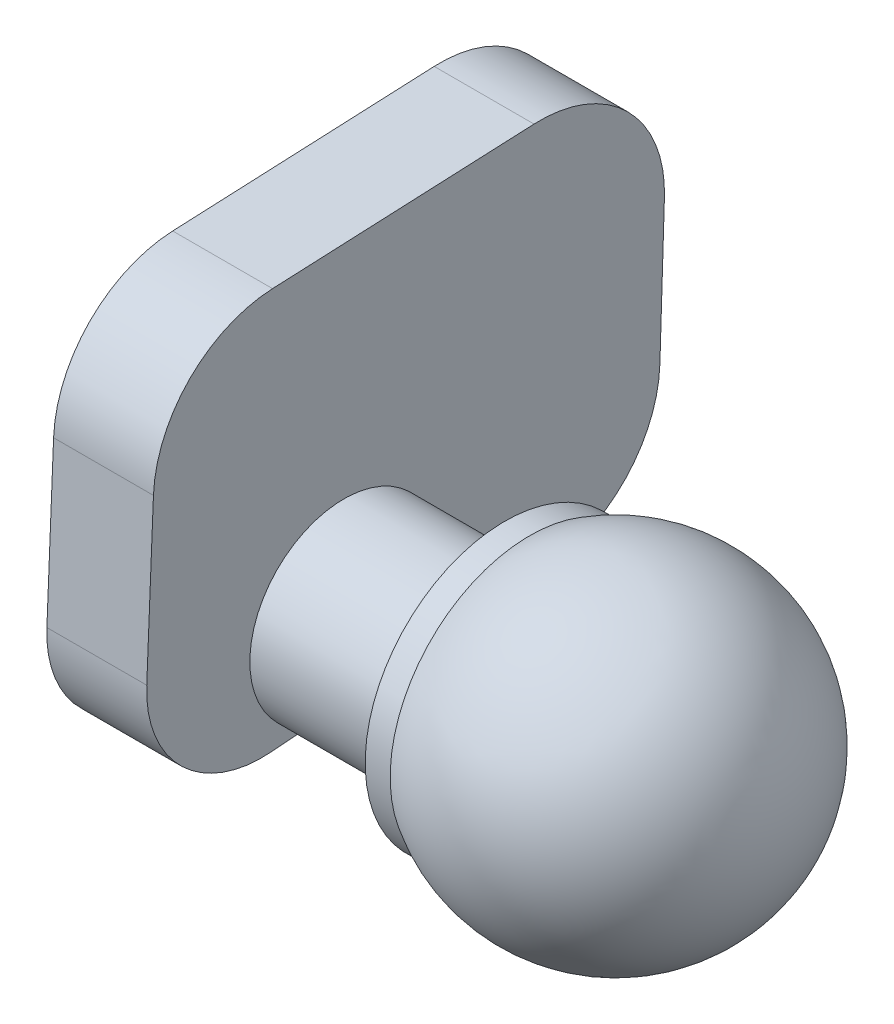
ISO-10303-21;
HEADER;
FILE_DESCRIPTION(('STEP AP214'),'2;1');
FILE_NAME('part.step','',(''),(''),'','','');
FILE_SCHEMA(('AUTOMOTIVE_DESIGN { 1 0 10303 214 1 1 1 1 }'));
ENDSEC;
DATA;
#1=APPLICATION_CONTEXT('core data for automotive mechanical design processes');
#2=APPLICATION_PROTOCOL_DEFINITION('international standard','automotive_design',2000,#1);
#3=PRODUCT_CONTEXT('',#1,'mechanical');
#4=PRODUCT('Part','Part','',(#3));
#5=PRODUCT_RELATED_PRODUCT_CATEGORY('part','',(#4));
#6=PRODUCT_DEFINITION_FORMATION('','',#4);
#7=PRODUCT_DEFINITION_CONTEXT('part definition',#1,'design');
#8=PRODUCT_DEFINITION('design','',#6,#7);
#9=PRODUCT_DEFINITION_SHAPE('','',#8);
#10=(LENGTH_UNIT() NAMED_UNIT(*) SI_UNIT(.MILLI.,.METRE.));
#11=(NAMED_UNIT(*) PLANE_ANGLE_UNIT() SI_UNIT($,.RADIAN.));
#12=(NAMED_UNIT(*) SI_UNIT($,.STERADIAN.) SOLID_ANGLE_UNIT());
#13=UNCERTAINTY_MEASURE_WITH_UNIT(LENGTH_MEASURE(1.E-05),#10,'distance_accuracy_value','');
#14=(GEOMETRIC_REPRESENTATION_CONTEXT(3) GLOBAL_UNCERTAINTY_ASSIGNED_CONTEXT((#13)) GLOBAL_UNIT_ASSIGNED_CONTEXT((#10,
#11,#12)) REPRESENTATION_CONTEXT('',''));
#15=CARTESIAN_POINT('',(0.,0.,0.));
#16=DIRECTION('',(0.,0.,1.));
#17=DIRECTION('',(1.,0.,0.));
#18=AXIS2_PLACEMENT_3D('',#15,#16,#17);
#19=CARTESIAN_POINT('',(4.,15.4804604314108,-19.2046076505677));
#20=DIRECTION('',(-1.,0.,0.));
#21=DIRECTION('',(0.,0.,1.));
#22=AXIS2_PLACEMENT_3D('',#19,#20,#21);
#23=CYLINDRICAL_SURFACE('',#22,4.62863554698001);
#24=CARTESIAN_POINT('',(0.,15.4804604314108,-19.2046076505677));
#25=DIRECTION('',(1.,0.,0.));
#26=DIRECTION('',(0.,0.,1.));
#27=AXIS2_PLACEMENT_3D('',#24,#25,#26);
#28=CIRCLE('',#27,4.62863554698001);
#29=CARTESIAN_POINT('',(0.,15.6727888455283,-14.5799696314477));
#30=VERTEX_POINT('',#29);
#31=CARTESIAN_POINT('',(0.,10.8655075399622,-19.5602434705827));
#32=VERTEX_POINT('',#31);
#33=EDGE_CURVE('E139',#30,#32,#28,.T.);
#34=ORIENTED_EDGE('',*,*,#33,.T.);
#35=DIRECTION('',(-1.,0.,0.));
#36=VECTOR('',#35,1.);
#37=CARTESIAN_POINT('',(4.,10.8655075399622,-19.5602434705827));
#38=LINE('',#37,#36);
#39=CARTESIAN_POINT('',(4.,10.8655075399622,-19.5602434705827));
#40=VERTEX_POINT('',#39);
#41=EDGE_CURVE('E41',#40,#32,#38,.T.);
#42=ORIENTED_EDGE('',*,*,#41,.F.);
#43=CARTESIAN_POINT('',(4.,15.4804604314108,-19.2046076505677));
#44=DIRECTION('',(1.,0.,0.));
#45=DIRECTION('',(0.,0.,1.));
#46=AXIS2_PLACEMENT_3D('',#43,#44,#45);
#47=CIRCLE('',#46,4.62863554698001);
#48=CARTESIAN_POINT('',(4.,15.6727888455283,-14.5799696314477));
#49=VERTEX_POINT('',#48);
#50=EDGE_CURVE('E155',#49,#40,#47,.T.);
#51=ORIENTED_EDGE('',*,*,#50,.F.);
#52=DIRECTION('',(-1.,0.,0.));
#53=VECTOR('',#52,1.);
#54=CARTESIAN_POINT('',(4.,15.6727888455283,-14.5799696314477));
#55=LINE('',#54,#53);
#56=EDGE_CURVE('E135',#49,#30,#55,.T.);
#57=ORIENTED_EDGE('',*,*,#56,.T.);
#58=EDGE_LOOP('',(#34,#42,#51,#57));
#59=FACE_BOUND('',#58,.T.);
#60=ADVANCED_FACE('F32',(#59),#23,.T.);
#61=CARTESIAN_POINT('',(4.,10.8655075399622,-19.5602434705827));
#62=DIRECTION('',(0.,0.997043911668439,0.0768338350266204));
#63=DIRECTION('',(0.,-0.0768338350266204,0.997043911668439));
#64=AXIS2_PLACEMENT_3D('',#61,#62,#63);
#65=PLANE('',#64);
#66=DIRECTION('',(0.,0.0768338350266204,-0.997043911668439));
#67=VECTOR('',#66,1.);
#68=CARTESIAN_POINT('',(0.,10.8655075399622,-19.5602434705827));
#69=LINE('',#68,#67);
#70=CARTESIAN_POINT('',(0.,11.7101605718647,-30.5209896397527));
#71=VERTEX_POINT('',#70);
#72=EDGE_CURVE('E142',#32,#71,#69,.T.);
#73=ORIENTED_EDGE('',*,*,#72,.T.);
#74=DIRECTION('',(-1.,0.,0.));
#75=VECTOR('',#74,1.);
#76=CARTESIAN_POINT('',(4.,11.7101605718647,-30.5209896397527));
#77=LINE('',#76,#75);
#78=CARTESIAN_POINT('',(4.,11.7101605718647,-30.5209896397527));
#79=VERTEX_POINT('',#78);
#80=EDGE_CURVE('E165',#79,#71,#77,.T.);
#81=ORIENTED_EDGE('',*,*,#80,.F.);
#82=DIRECTION('',(0.,0.0768338350266204,-0.997043911668439));
#83=VECTOR('',#82,1.);
#84=CARTESIAN_POINT('',(4.,10.8655075399622,-19.5602434705827));
#85=LINE('',#84,#83);
#86=CARTESIAN_POINT('',(4.,11.2475056293288,-24.5172896617561));
#87=VERTEX_POINT('',#86);
#88=EDGE_CURVE('E193',#87,#79,#85,.T.);
#89=ORIENTED_EDGE('',*,*,#88,.F.);
#90=CARTESIAN_POINT('',(4.,10.9725772527079,-20.9496470475379));
#91=VERTEX_POINT('',#90);
#92=EDGE_CURVE('E192',#91,#87,#85,.T.);
#93=ORIENTED_EDGE('',*,*,#92,.F.);
#94=EDGE_CURVE('E97',#40,#91,#85,.T.);
#95=ORIENTED_EDGE('',*,*,#94,.F.);
#96=ORIENTED_EDGE('',*,*,#41,.T.);
#97=EDGE_LOOP('',(#73,#81,#89,#93,#95,#96));
#98=FACE_BOUND('',#97,.T.);
#99=ADVANCED_FACE('F168',(#98),#65,.F.);
#100=CARTESIAN_POINT('',(4.,16.6953801302069,-30.1368204646196));
#101=DIRECTION('',(-1.,0.,0.));
#102=DIRECTION('',(0.,0.,1.));
#103=AXIS2_PLACEMENT_3D('',#100,#101,#102);
#104=CYLINDRICAL_SURFACE('',#103,5.00000000000001);
#105=CARTESIAN_POINT('',(0.,16.6953801302069,-30.1368204646196));
#106=DIRECTION('',(1.,0.,0.));
#107=DIRECTION('',(0.,0.,1.));
#108=AXIS2_PLACEMENT_3D('',#105,#106,#107);
#109=CIRCLE('',#108,5.00000000000001);
#110=CARTESIAN_POINT('',(0.,16.5360030051006,-35.1342797122767));
#111=VERTEX_POINT('',#110);
#112=EDGE_CURVE('E145',#71,#111,#109,.T.);
#113=ORIENTED_EDGE('',*,*,#112,.T.);
#114=DIRECTION('',(-1.,0.,0.));
#115=VECTOR('',#114,1.);
#116=CARTESIAN_POINT('',(4.,16.5360030051006,-35.1342797122767));
#117=LINE('',#116,#115);
#118=CARTESIAN_POINT('',(4.,16.5360030051006,-35.1342797122767));
#119=VERTEX_POINT('',#118);
#120=EDGE_CURVE('E162',#119,#111,#117,.T.);
#121=ORIENTED_EDGE('',*,*,#120,.F.);
#122=CARTESIAN_POINT('',(4.,16.6953801302069,-30.1368204646196));
#123=DIRECTION('',(1.,0.,0.));
#124=DIRECTION('',(0.,0.,1.));
#125=AXIS2_PLACEMENT_3D('',#122,#123,#124);
#126=CIRCLE('',#125,5.00000000000001);
#127=EDGE_CURVE('E187',#79,#119,#126,.T.);
#128=ORIENTED_EDGE('',*,*,#127,.F.);
#129=ORIENTED_EDGE('',*,*,#80,.T.);
#130=EDGE_LOOP('',(#113,#121,#128,#129));
#131=FACE_BOUND('',#130,.T.);
#132=ADVANCED_FACE('F180',(#131),#104,.T.);
#133=CARTESIAN_POINT('',(4.,22.2281323093602,-35.3158109983341));
#134=DIRECTION('',(0.,0.031875425021274,0.999491849531407));
#135=DIRECTION('',(0.,-0.999491849531407,0.031875425021274));
#136=AXIS2_PLACEMENT_3D('',#133,#134,#135);
#137=PLANE('',#136);
#138=DIRECTION('',(0.,0.999491849531407,-0.031875425021274));
#139=VECTOR('',#138,1.);
#140=CARTESIAN_POINT('',(0.,22.2281323093602,-35.3158109983341));
#141=LINE('',#140,#139);
#142=CARTESIAN_POINT('',(0.,22.2281323093602,-35.3158109983341));
#143=VERTEX_POINT('',#142);
#144=EDGE_CURVE('E147',#111,#143,#141,.T.);
#145=ORIENTED_EDGE('',*,*,#144,.T.);
#146=DIRECTION('',(-1.,0.,0.));
#147=VECTOR('',#146,1.);
#148=CARTESIAN_POINT('',(4.,22.2281323093602,-35.3158109983341));
#149=LINE('',#148,#147);
#150=CARTESIAN_POINT('',(4.,22.2281323093602,-35.3158109983341));
#151=VERTEX_POINT('',#150);
#152=EDGE_CURVE('E159',#151,#143,#149,.T.);
#153=ORIENTED_EDGE('',*,*,#152,.F.);
#154=DIRECTION('',(0.,0.999491849531407,-0.031875425021274));
#155=VECTOR('',#154,1.);
#156=CARTESIAN_POINT('',(4.,22.2281323093602,-35.3158109983341));
#157=LINE('',#156,#155);
#158=EDGE_CURVE('E186',#119,#151,#157,.T.);
#159=ORIENTED_EDGE('',*,*,#158,.F.);
#160=ORIENTED_EDGE('',*,*,#120,.T.);
#161=EDGE_LOOP('',(#145,#153,#159,#160));
#162=FACE_BOUND('',#161,.T.);
#163=ADVANCED_FACE('F184',(#162),#137,.F.);
#164=CARTESIAN_POINT('',(4.,22.3875094344666,-30.318351750677));
#165=DIRECTION('',(-1.,0.,0.));
#166=DIRECTION('',(0.,0.,1.));
#167=AXIS2_PLACEMENT_3D('',#164,#165,#166);
#168=CYLINDRICAL_SURFACE('',#167,5.);
#169=CARTESIAN_POINT('',(0.,22.3875094344666,-30.318351750677));
#170=DIRECTION('',(1.,0.,0.));
#171=DIRECTION('',(0.,0.,1.));
#172=AXIS2_PLACEMENT_3D('',#169,#170,#171);
#173=CIRCLE('',#172,5.);
#174=CARTESIAN_POINT('',(0.,27.3824435532535,-30.0933336425655));
#175=VERTEX_POINT('',#174);
#176=EDGE_CURVE('E149',#143,#175,#173,.T.);
#177=ORIENTED_EDGE('',*,*,#176,.T.);
#178=DIRECTION('',(-1.,0.,0.));
#179=VECTOR('',#178,1.);
#180=CARTESIAN_POINT('',(4.,27.3824435532535,-30.0933336425655));
#181=LINE('',#180,#179);
#182=CARTESIAN_POINT('',(4.,27.3824435532535,-30.0933336425655));
#183=VERTEX_POINT('',#182);
#184=EDGE_CURVE('E130',#183,#175,#181,.T.);
#185=ORIENTED_EDGE('',*,*,#184,.F.);
#186=CARTESIAN_POINT('',(4.,22.3875094344666,-30.318351750677));
#187=DIRECTION('',(1.,0.,0.));
#188=DIRECTION('',(0.,0.,1.));
#189=AXIS2_PLACEMENT_3D('',#186,#187,#188);
#190=CIRCLE('',#189,5.);
#191=EDGE_CURVE('E118',#151,#183,#190,.T.);
#192=ORIENTED_EDGE('',*,*,#191,.F.);
#193=ORIENTED_EDGE('',*,*,#152,.T.);
#194=EDGE_LOOP('',(#177,#185,#192,#193));
#195=FACE_BOUND('',#194,.T.);
#196=ADVANCED_FACE('F230',(#195),#168,.T.);
#197=CARTESIAN_POINT('',(4.,26.9105780208937,-19.6188999765666));
#198=DIRECTION('',(0.,-0.998986823757389,-0.0450036216223152));
#199=DIRECTION('',(0.,0.0450036216223152,-0.998986823757389));
#200=AXIS2_PLACEMENT_3D('',#197,#198,#199);
#201=PLANE('',#200);
#202=DIRECTION('',(0.,-0.0450036216223151,0.998986823757388));
#203=VECTOR('',#202,1.);
#204=CARTESIAN_POINT('',(0.,26.9105780208937,-19.6188999765666));
#205=LINE('',#204,#203);
#206=CARTESIAN_POINT('',(0.,26.9105780208937,-19.6188999765666));
#207=VERTEX_POINT('',#206);
#208=EDGE_CURVE('E127',#175,#207,#205,.T.);
#209=ORIENTED_EDGE('',*,*,#208,.T.);
#210=DIRECTION('',(-1.,0.,0.));
#211=VECTOR('',#210,1.);
#212=CARTESIAN_POINT('',(4.,26.9105780208937,-19.6188999765666));
#213=LINE('',#212,#211);
#214=CARTESIAN_POINT('',(4.,26.9105780208937,-19.6188999765666));
#215=VERTEX_POINT('',#214);
#216=EDGE_CURVE('E124',#215,#207,#213,.T.);
#217=ORIENTED_EDGE('',*,*,#216,.F.);
#218=DIRECTION('',(0.,-0.0450036216223151,0.998986823757388));
#219=VECTOR('',#218,1.);
#220=CARTESIAN_POINT('',(4.,26.9105780208937,-19.6188999765666));
#221=LINE('',#220,#219);
#222=EDGE_CURVE('E111',#183,#215,#221,.T.);
#223=ORIENTED_EDGE('',*,*,#222,.F.);
#224=ORIENTED_EDGE('',*,*,#184,.T.);
#225=EDGE_LOOP('',(#209,#217,#223,#224));
#226=FACE_BOUND('',#225,.T.);
#227=ADVANCED_FACE('F125',(#226),#201,.F.);
#228=CARTESIAN_POINT('',(4.,21.9156439021068,-19.8439180846781));
#229=DIRECTION('',(-1.,0.,0.));
#230=DIRECTION('',(0.,0.,1.));
#231=AXIS2_PLACEMENT_3D('',#228,#229,#230);
#232=CYLINDRICAL_SURFACE('',#231,5.);
#233=CARTESIAN_POINT('',(0.,21.9156439021068,-19.8439180846781));
#234=DIRECTION('',(1.,0.,0.));
#235=DIRECTION('',(0.,0.,-1.));
#236=AXIS2_PLACEMENT_3D('',#233,#234,#235);
#237=CIRCLE('',#236,5.);
#238=CARTESIAN_POINT('',(0.,22.1234031998149,-14.8482363419912));
#239=VERTEX_POINT('',#238);
#240=EDGE_CURVE('E152',#207,#239,#237,.T.);
#241=ORIENTED_EDGE('',*,*,#240,.T.);
#242=DIRECTION('',(-1.,0.,0.));
#243=VECTOR('',#242,1.);
#244=CARTESIAN_POINT('',(4.,22.1234031998149,-14.8482363419912));
#245=LINE('',#244,#243);
#246=CARTESIAN_POINT('',(4.,22.1234031998149,-14.8482363419912));
#247=VERTEX_POINT('',#246);
#248=EDGE_CURVE('E131',#247,#239,#245,.T.);
#249=ORIENTED_EDGE('',*,*,#248,.F.);
#250=CARTESIAN_POINT('',(4.,21.9156439021068,-19.8439180846781));
#251=DIRECTION('',(1.,0.,0.));
#252=DIRECTION('',(0.,0.,-1.));
#253=AXIS2_PLACEMENT_3D('',#250,#251,#252);
#254=CIRCLE('',#253,5.);
#255=EDGE_CURVE('E115',#215,#247,#254,.T.);
#256=ORIENTED_EDGE('',*,*,#255,.F.);
#257=ORIENTED_EDGE('',*,*,#216,.T.);
#258=EDGE_LOOP('',(#241,#249,#256,#257));
#259=FACE_BOUND('',#258,.T.);
#260=ADVANCED_FACE('F133',(#259),#232,.T.);
#261=CARTESIAN_POINT('',(4.,22.1234031998149,-14.8482363419912));
#262=DIRECTION('',(0.,-0.0415518595416226,-0.999136348537392));
#263=DIRECTION('',(0.,0.999136348537392,-0.0415518595416226));
#264=AXIS2_PLACEMENT_3D('',#261,#262,#263);
#265=PLANE('',#264);
#266=DIRECTION('',(0.,-0.999136348537392,0.0415518595416226));
#267=VECTOR('',#266,1.);
#268=CARTESIAN_POINT('',(0.,22.1234031998149,-14.8482363419912));
#269=LINE('',#268,#267);
#270=EDGE_CURVE('E89',#239,#30,#269,.T.);
#271=ORIENTED_EDGE('',*,*,#270,.T.);
#272=ORIENTED_EDGE('',*,*,#56,.F.);
#273=DIRECTION('',(0.,-0.999136348537392,0.0415518595416226));
#274=VECTOR('',#273,1.);
#275=CARTESIAN_POINT('',(4.,22.1234031998149,-14.8482363419912));
#276=LINE('',#275,#274);
#277=EDGE_CURVE('E56',#247,#49,#276,.T.);
#278=ORIENTED_EDGE('',*,*,#277,.F.);
#279=ORIENTED_EDGE('',*,*,#248,.T.);
#280=EDGE_LOOP('',(#271,#272,#278,#279));
#281=FACE_BOUND('',#280,.T.);
#282=ADVANCED_FACE('F238',(#281),#265,.F.);
#283=CARTESIAN_POINT('',(4.,15.4804604314108,-19.2046076505677));
#284=DIRECTION('',(-1.,0.,0.));
#285=DIRECTION('',(0.,0.,1.));
#286=AXIS2_PLACEMENT_3D('',#283,#284,#285);
#287=PLANE('',#286);
#288=CARTESIAN_POINT('',(4.,14.4186612649548,-22.4785006980142));
#289=DIRECTION('',(1.,0.,0.));
#290=DIRECTION('',(0.,0.,-1.));
#291=AXIS2_PLACEMENT_3D('',#288,#289,#290);
#292=CIRCLE('',#291,3.76999847533634);
#293=EDGE_CURVE('E11',#87,#91,#292,.T.);
#294=ORIENTED_EDGE('',*,*,#293,.F.);
#295=ORIENTED_EDGE('',*,*,#88,.T.);
#296=ORIENTED_EDGE('',*,*,#127,.T.);
#297=ORIENTED_EDGE('',*,*,#158,.T.);
#298=ORIENTED_EDGE('',*,*,#191,.T.);
#299=ORIENTED_EDGE('',*,*,#222,.T.);
#300=ORIENTED_EDGE('',*,*,#255,.T.);
#301=ORIENTED_EDGE('',*,*,#277,.T.);
#302=ORIENTED_EDGE('',*,*,#50,.T.);
#303=ORIENTED_EDGE('',*,*,#94,.T.);
#304=EDGE_LOOP('',(#294,#295,#296,#297,#298,#299,#300,#301,#302,#303));
#305=FACE_BOUND('',#304,.T.);
#306=ADVANCED_FACE('F113',(#305),#287,.F.);
#307=CARTESIAN_POINT('',(0.,15.4804604314108,-19.2046076505677));
#308=DIRECTION('',(-1.,0.,0.));
#309=DIRECTION('',(0.,0.,1.));
#310=AXIS2_PLACEMENT_3D('',#307,#308,#309);
#311=PLANE('',#310);
#312=ORIENTED_EDGE('',*,*,#33,.F.);
#313=ORIENTED_EDGE('',*,*,#270,.F.);
#314=ORIENTED_EDGE('',*,*,#240,.F.);
#315=ORIENTED_EDGE('',*,*,#208,.F.);
#316=ORIENTED_EDGE('',*,*,#176,.F.);
#317=ORIENTED_EDGE('',*,*,#144,.F.);
#318=ORIENTED_EDGE('',*,*,#112,.F.);
#319=ORIENTED_EDGE('',*,*,#72,.F.);
#320=EDGE_LOOP('',(#312,#313,#314,#315,#316,#317,#318,#319));
#321=FACE_BOUND('',#320,.T.);
#322=ADVANCED_FACE('F174',(#321),#311,.T.);
#323=CARTESIAN_POINT('',(4.,14.4186612649548,-22.4785006980142));
#324=DIRECTION('',(1.,0.,0.));
#325=DIRECTION('',(0.,0.,-1.));
#326=AXIS2_PLACEMENT_3D('',#323,#324,#325);
#327=PLANE('',#326);
#328=EDGE_CURVE('E43',#91,#87,#292,.T.);
#329=ORIENTED_EDGE('',*,*,#328,.F.);
#330=ORIENTED_EDGE('',*,*,#92,.T.);
#331=EDGE_LOOP('',(#329,#330));
#332=FACE_BOUND('',#331,.T.);
#333=ADVANCED_FACE('F215',(#332),#327,.F.);
#334=CARTESIAN_POINT('',(10.,14.4186612649548,-22.4785006980142));
#335=DIRECTION('',(-1.,0.,0.));
#336=DIRECTION('',(0.,0.,1.));
#337=AXIS2_PLACEMENT_3D('',#334,#335,#336);
#338=CYLINDRICAL_SURFACE('',#337,3.76999847533634);
#339=CARTESIAN_POINT('',(10.,14.4186612649548,-22.4785006980142));
#340=DIRECTION('',(1.,0.,0.));
#341=DIRECTION('',(0.,0.,-1.));
#342=AXIS2_PLACEMENT_3D('',#339,#340,#341);
#343=CIRCLE('',#342,3.76999847533634);
#344=CARTESIAN_POINT('',(10.,14.4186612649548,-26.2484991733505));
#345=VERTEX_POINT('',#344);
#346=EDGE_CURVE('E143',#345,#345,#343,.T.);
#347=ORIENTED_EDGE('',*,*,#346,.F.);
#348=EDGE_LOOP('',(#347));
#349=FACE_BOUND('',#348,.T.);
#350=ORIENTED_EDGE('',*,*,#328,.T.);
#351=ORIENTED_EDGE('',*,*,#293,.T.);
#352=EDGE_LOOP('',(#350,#351));
#353=FACE_BOUND('',#352,.T.);
#354=ADVANCED_FACE('F208',(#349,#353),#338,.T.);
#355=CARTESIAN_POINT('',(11.,14.6012167902541,-22.9207174818953));
#356=DIRECTION('',(-1.,0.,0.));
#357=DIRECTION('',(0.,0.,1.));
#358=AXIS2_PLACEMENT_3D('',#355,#356,#357);
#359=CYLINDRICAL_SURFACE('',#358,5.59027789396989);
#360=CARTESIAN_POINT('',(11.,14.6012167902541,-22.9207174818953));
#361=DIRECTION('',(1.,0.,0.));
#362=DIRECTION('',(0.,0.,-1.));
#363=AXIS2_PLACEMENT_3D('',#360,#361,#362);
#364=CIRCLE('',#363,5.59027789396989);
#365=CARTESIAN_POINT('',(11.,14.6012167902541,-28.5109953758652));
#366=VERTEX_POINT('',#365);
#367=EDGE_CURVE('E36',#366,#366,#364,.T.);
#368=ORIENTED_EDGE('',*,*,#367,.F.);
#369=EDGE_LOOP('',(#368));
#370=FACE_BOUND('',#369,.T.);
#371=CARTESIAN_POINT('',(10.,14.6012167902541,-22.9207174818953));
#372=DIRECTION('',(1.,0.,0.));
#373=DIRECTION('',(0.,0.,-1.));
#374=AXIS2_PLACEMENT_3D('',#371,#372,#373);
#375=CIRCLE('',#374,5.59027789396989);
#376=CARTESIAN_POINT('',(10.,14.6012167902541,-28.5109953758652));
#377=VERTEX_POINT('',#376);
#378=EDGE_CURVE('E198',#377,#377,#375,.T.);
#379=ORIENTED_EDGE('',*,*,#378,.T.);
#380=EDGE_LOOP('',(#379));
#381=FACE_BOUND('',#380,.T.);
#382=ADVANCED_FACE('F206',(#370,#381),#359,.T.);
#383=CARTESIAN_POINT('',(14.4374396534096,14.6012167902541,-22.9207174818953));
#384=DIRECTION('',(0.,0.,1.));
#385=DIRECTION('',(1.,0.,0.));
#386=AXIS2_PLACEMENT_3D('',#383,#384,#385);
#387=SPHERICAL_SURFACE('',#386,6.56256034659042);
#388=CARTESIAN_POINT('',(14.4374396534096,14.6012167902541,-22.9207174818953));
#389=DIRECTION('',(1.,0.,0.));
#390=DIRECTION('',(0.,0.,-1.));
#391=AXIS2_PLACEMENT_3D('',#388,#389,#390);
#392=SPHERICAL_SURFACE('',#391,6.56256034659042);
#393=ORIENTED_EDGE('',*,*,#367,.T.);
#394=EDGE_LOOP('',(#393));
#395=FACE_BOUND('',#394,.T.);
#396=ADVANCED_FACE('F34',(#395),#392,.T.);
#397=CARTESIAN_POINT('',(10.,14.6012167902541,-22.9207174818953));
#398=DIRECTION('',(1.,0.,0.));
#399=DIRECTION('',(0.,0.,-1.));
#400=AXIS2_PLACEMENT_3D('',#397,#398,#399);
#401=PLANE('',#400);
#402=ORIENTED_EDGE('',*,*,#346,.T.);
#403=EDGE_LOOP('',(#402));
#404=FACE_BOUND('',#403,.T.);
#405=ORIENTED_EDGE('',*,*,#378,.F.);
#406=EDGE_LOOP('',(#405));
#407=FACE_BOUND('',#406,.T.);
#408=ADVANCED_FACE('F214',(#404,#407),#401,.F.);
#409=CLOSED_SHELL('',(#60,#99,#132,#163,#196,#227,#260,#282,#306,#322,#333,#354,#382,#396,#408));
#410=MANIFOLD_SOLID_BREP('B2',#409);
#411=ADVANCED_BREP_SHAPE_REPRESENTATION('',(#18,#410),#14);
#412=SHAPE_DEFINITION_REPRESENTATION(#9,#411);
ENDSEC;
END-ISO-10303-21;
